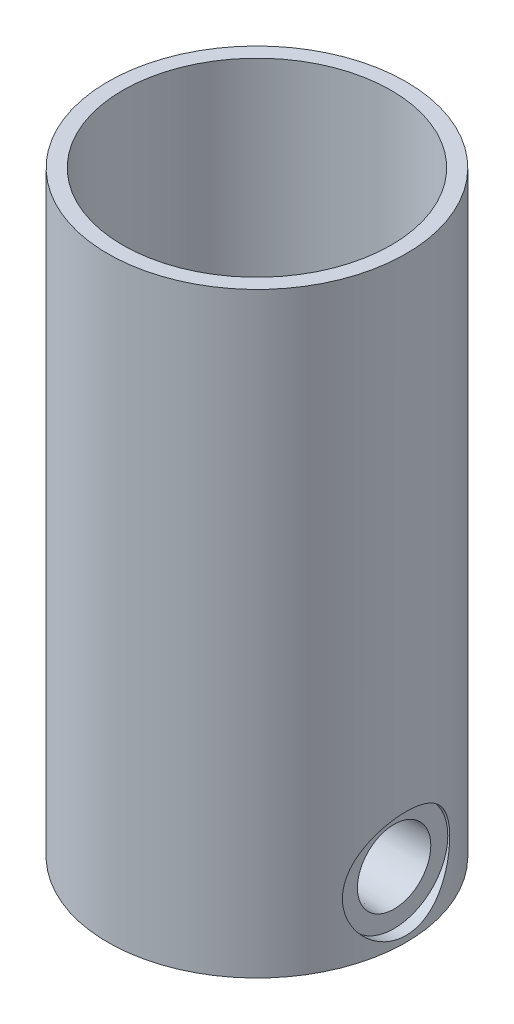
ISO-10303-21;
HEADER;
FILE_DESCRIPTION(('STEP AP214'),'2;1');
FILE_NAME('part.step','',(''),(''),'','','');
FILE_SCHEMA(('AUTOMOTIVE_DESIGN { 1 0 10303 214 1 1 1 1 }'));
ENDSEC;
DATA;
#1=APPLICATION_CONTEXT('core data for automotive mechanical design processes');
#2=APPLICATION_PROTOCOL_DEFINITION('international standard','automotive_design',2000,#1);
#3=PRODUCT_CONTEXT('',#1,'mechanical');
#4=PRODUCT('Part','Part','',(#3));
#5=PRODUCT_RELATED_PRODUCT_CATEGORY('part','',(#4));
#6=PRODUCT_DEFINITION_FORMATION('','',#4);
#7=PRODUCT_DEFINITION_CONTEXT('part definition',#1,'design');
#8=PRODUCT_DEFINITION('design','',#6,#7);
#9=PRODUCT_DEFINITION_SHAPE('','',#8);
#10=(LENGTH_UNIT() NAMED_UNIT(*) SI_UNIT(.MILLI.,.METRE.));
#11=(NAMED_UNIT(*) PLANE_ANGLE_UNIT() SI_UNIT($,.RADIAN.));
#12=(NAMED_UNIT(*) SI_UNIT($,.STERADIAN.) SOLID_ANGLE_UNIT());
#13=UNCERTAINTY_MEASURE_WITH_UNIT(LENGTH_MEASURE(1.E-05),#10,'distance_accuracy_value','');
#14=(GEOMETRIC_REPRESENTATION_CONTEXT(3) GLOBAL_UNCERTAINTY_ASSIGNED_CONTEXT((#13)) GLOBAL_UNIT_ASSIGNED_CONTEXT((#10,
#11,#12)) REPRESENTATION_CONTEXT('',''));
#15=CARTESIAN_POINT('',(0.,0.,0.));
#16=DIRECTION('',(0.,0.,1.));
#17=DIRECTION('',(1.,0.,0.));
#18=AXIS2_PLACEMENT_3D('',#15,#16,#17);
#19=CARTESIAN_POINT('',(5.30999999995174,10.,0.));
#20=DIRECTION('',(1.,0.,0.));
#21=DIRECTION('',(0.,0.,-1.));
#22=AXIS2_PLACEMENT_3D('',#19,#20,#21);
#23=CONICAL_SURFACE('',#22,5.34999999996444,1.02974425867466);
#24=CARTESIAN_POINT('',(2.09539568822948,10.,0.));
#25=VERTEX_POINT('',#24);
#26=VERTEX_LOOP('',#25);
#27=FACE_BOUND('',#26,.T.);
#28=CARTESIAN_POINT('',(5.31,10.,0.));
#29=DIRECTION('',(1.,0.,0.));
#30=DIRECTION('',(0.,0.,-1.));
#31=AXIS2_PLACEMENT_3D('',#28,#29,#30);
#32=CIRCLE('',#31,5.35);
#33=CARTESIAN_POINT('',(5.31,10.,-5.35));
#34=VERTEX_POINT('',#33);
#35=EDGE_CURVE('E32',#34,#34,#32,.T.);
#36=ORIENTED_EDGE('',*,*,#35,.T.);
#37=EDGE_LOOP('',(#36));
#38=FACE_BOUND('',#37,.T.);
#39=ADVANCED_FACE('F16',(#27,#38),#23,.F.);
#40=CARTESIAN_POINT('',(23.,10.,0.));
#41=DIRECTION('',(1.,0.,0.));
#42=DIRECTION('',(0.,0.,-1.));
#43=AXIS2_PLACEMENT_3D('',#40,#41,#42);
#44=CYLINDRICAL_SURFACE('',#43,5.35);
#45=ORIENTED_EDGE('',*,*,#35,.F.);
#46=EDGE_LOOP('',(#45));
#47=FACE_BOUND('',#46,.T.);
#48=CARTESIAN_POINT('',(12.,10.,0.));
#49=DIRECTION('',(1.,0.,0.));
#50=DIRECTION('',(0.,0.,-1.));
#51=AXIS2_PLACEMENT_3D('',#48,#49,#50);
#52=CIRCLE('',#51,5.35);
#53=CARTESIAN_POINT('',(12.,10.,-5.35));
#54=VERTEX_POINT('',#53);
#55=EDGE_CURVE('E19',#54,#54,#52,.T.);
#56=ORIENTED_EDGE('',*,*,#55,.T.);
#57=EDGE_LOOP('',(#56));
#58=FACE_BOUND('',#57,.T.);
#59=ADVANCED_FACE('F29',(#47,#58),#44,.F.);
#60=CARTESIAN_POINT('',(12.,15.35,0.));
#61=DIRECTION('',(-1.,0.,0.));
#62=DIRECTION('',(0.,0.,1.));
#63=AXIS2_PLACEMENT_3D('',#60,#61,#62);
#64=PLANE('',#63);
#65=CARTESIAN_POINT('',(12.0000000000005,10.,0.));
#66=DIRECTION('',(1.,0.,0.));
#67=DIRECTION('',(0.,0.,-1.));
#68=AXIS2_PLACEMENT_3D('',#65,#66,#67);
#69=CIRCLE('',#68,5.81061716828301);
#70=CARTESIAN_POINT('',(12.0000000000005,10.,-5.81061716828301));
#71=VERTEX_POINT('',#70);
#72=EDGE_CURVE('E36',#71,#71,#69,.T.);
#73=ORIENTED_EDGE('',*,*,#72,.T.);
#74=EDGE_LOOP('',(#73));
#75=FACE_BOUND('',#74,.T.);
#76=ORIENTED_EDGE('',*,*,#55,.F.);
#77=EDGE_LOOP('',(#76));
#78=FACE_BOUND('',#77,.T.);
#79=ADVANCED_FACE('F90',(#75,#78),#64,.F.);
#80=CARTESIAN_POINT('',(22.9999999999108,10.,0.));
#81=DIRECTION('',(1.,0.,0.));
#82=DIRECTION('',(0.,0.,-1.));
#83=AXIS2_PLACEMENT_3D('',#80,#81,#82);
#84=CONICAL_SURFACE('',#83,6.15399999999688,0.0312064870254975);
#85=CARTESIAN_POINT('',(23.0000000000245,10.,0.));
#86=DIRECTION('',(1.,0.,0.));
#87=DIRECTION('',(0.,0.,-1.));
#88=AXIS2_PLACEMENT_3D('',#85,#86,#87);
#89=CIRCLE('',#88,6.15400000000043);
#90=CARTESIAN_POINT('',(23.0000000000245,10.,-6.15400000000043));
#91=VERTEX_POINT('',#90);
#92=EDGE_CURVE('E83',#91,#91,#89,.F.);
#93=ORIENTED_EDGE('',*,*,#92,.F.);
#94=EDGE_LOOP('',(#93));
#95=FACE_BOUND('',#94,.T.);
#96=ORIENTED_EDGE('',*,*,#72,.F.);
#97=EDGE_LOOP('',(#96));
#98=FACE_BOUND('',#97,.T.);
#99=ADVANCED_FACE('F93',(#95,#98),#84,.F.);
#100=CARTESIAN_POINT('',(0.,20.,0.));
#101=DIRECTION('',(0.,1.,0.));
#102=DIRECTION('',(0.,0.,1.));
#103=AXIS2_PLACEMENT_3D('',#100,#101,#102);
#104=PLANE('',#103);
#105=CARTESIAN_POINT('',(0.,20.,0.));
#106=DIRECTION('',(0.,1.,0.));
#107=DIRECTION('',(0.,0.,1.));
#108=AXIS2_PLACEMENT_3D('',#105,#106,#107);
#109=CIRCLE('',#108,22.5);
#110=CARTESIAN_POINT('',(0.,20.,22.5));
#111=VERTEX_POINT('',#110);
#112=EDGE_CURVE('E79',#111,#111,#109,.T.);
#113=ORIENTED_EDGE('',*,*,#112,.T.);
#114=EDGE_LOOP('',(#113));
#115=FACE_BOUND('',#114,.T.);
#116=ADVANCED_FACE('F95',(#115),#104,.T.);
#117=CARTESIAN_POINT('',(23.,10.,0.));
#118=DIRECTION('',(1.,0.,0.));
#119=DIRECTION('',(0.,0.,-1.));
#120=AXIS2_PLACEMENT_3D('',#117,#118,#119);
#121=PLANE('',#120);
#122=CARTESIAN_POINT('',(23.,10.,0.));
#123=DIRECTION('',(1.,0.,0.));
#124=DIRECTION('',(0.,0.,-1.));
#125=AXIS2_PLACEMENT_3D('',#122,#123,#124);
#126=CIRCLE('',#125,9.);
#127=CARTESIAN_POINT('',(23.,10.,-9.));
#128=VERTEX_POINT('',#127);
#129=EDGE_CURVE('E77',#128,#128,#126,.T.);
#130=ORIENTED_EDGE('',*,*,#129,.T.);
#131=EDGE_LOOP('',(#130));
#132=FACE_BOUND('',#131,.T.);
#133=ORIENTED_EDGE('',*,*,#92,.T.);
#134=EDGE_LOOP('',(#133));
#135=FACE_BOUND('',#134,.T.);
#136=ADVANCED_FACE('F103',(#132,#135),#121,.T.);
#137=CARTESIAN_POINT('',(0.,20.,0.));
#138=DIRECTION('',(0.,1.,0.));
#139=DIRECTION('',(0.,0.,1.));
#140=AXIS2_PLACEMENT_3D('',#137,#138,#139);
#141=CYLINDRICAL_SURFACE('',#140,22.5);
#142=CARTESIAN_POINT('',(0.,100.,0.));
#143=DIRECTION('',(0.,1.,0.));
#144=DIRECTION('',(0.,0.,1.));
#145=AXIS2_PLACEMENT_3D('',#142,#143,#144);
#146=CIRCLE('',#145,22.5);
#147=CARTESIAN_POINT('',(0.,100.,22.5));
#148=VERTEX_POINT('',#147);
#149=EDGE_CURVE('E48',#148,#148,#146,.F.);
#150=ORIENTED_EDGE('',*,*,#149,.F.);
#151=EDGE_LOOP('',(#150));
#152=FACE_BOUND('',#151,.T.);
#153=ORIENTED_EDGE('',*,*,#112,.F.);
#154=EDGE_LOOP('',(#153));
#155=FACE_BOUND('',#154,.T.);
#156=ADVANCED_FACE('F70',(#152,#155),#141,.F.);
#157=CARTESIAN_POINT('',(23.,10.,0.));
#158=DIRECTION('',(1.,0.,0.));
#159=DIRECTION('',(0.,0.,-1.));
#160=AXIS2_PLACEMENT_3D('',#157,#158,#159);
#161=CYLINDRICAL_SURFACE('',#160,9.);
#162=ORIENTED_EDGE('',*,*,#129,.F.);
#163=EDGE_LOOP('',(#162));
#164=FACE_BOUND('',#163,.T.);
#165=CARTESIAN_POINT('',(23.3238075793812,10.,9.));
#166=CARTESIAN_POINT('',(23.3238073243132,10.2435480961337,9.00000030787731));
#167=CARTESIAN_POINT('',(23.3276327611524,10.4870920076392,8.99010557007337));
#168=CARTESIAN_POINT('',(23.3428097242563,10.9724290694668,8.95062457763446));
#169=CARTESIAN_POINT('',(23.3541639587674,11.214221558118,8.92103123703639));
#170=CARTESIAN_POINT('',(23.384048383551,11.6944711134606,8.84240049878084));
#171=CARTESIAN_POINT('',(23.4025872864994,11.9329237648284,8.79333949141597));
#172=CARTESIAN_POINT('',(23.4462553154958,12.4045931693559,8.6762325371848));
#173=CARTESIAN_POINT('',(23.4713870508155,12.6378078096847,8.60817907291485));
#174=CARTESIAN_POINT('',(23.5273723206745,13.0965956549283,8.45396081778693));
#175=CARTESIAN_POINT('',(23.5582066395291,13.3221915990969,8.36785672475123));
#176=CARTESIAN_POINT('',(23.6247439265045,13.7651791528606,8.17811486576643));
#177=CARTESIAN_POINT('',(23.6604487349791,13.9825676213604,8.07447046849236));
#178=CARTESIAN_POINT('',(23.7733436595022,14.6202182677816,7.73847997898592));
#179=CARTESIAN_POINT('',(23.8563779986869,15.0264597965972,7.48090928227957));
#180=CARTESIAN_POINT('',(24.0328982845355,15.807886743529,6.89328062382664));
#181=CARTESIAN_POINT('',(24.126675687287,16.1810704981816,6.56064766190437));
#182=CARTESIAN_POINT('',(24.2653504590756,16.6958631602608,6.01894530819016));
#183=CARTESIAN_POINT('',(24.3112719799821,16.8600533669467,5.83111968311396));
#184=CARTESIAN_POINT('',(24.4012650471891,17.1724540222947,5.44224434122988));
#185=CARTESIAN_POINT('',(24.445337279347,17.3206704278283,5.24119959937723));
#186=CARTESIAN_POINT('',(24.5318183066782,17.6045360240128,4.82052368047023));
#187=CARTESIAN_POINT('',(24.5741310241652,17.7396425325252,4.60050658572886));
#188=CARTESIAN_POINT('',(24.6543530961232,17.9906991287134,4.14914204951195));
#189=CARTESIAN_POINT('',(24.6922642118277,18.1066568863666,3.91779919291209));
#190=CARTESIAN_POINT('',(24.7626135989154,18.3184744440412,3.44528852807126));
#191=CARTESIAN_POINT('',(24.7950520574702,18.414334931441,3.20412105619452));
#192=CARTESIAN_POINT('',(24.8535057078059,18.5850558862034,2.71370893714171));
#193=CARTESIAN_POINT('',(24.8795212247739,18.6599174167488,2.46446469960744));
#194=CARTESIAN_POINT('',(24.9234531575662,18.7853187023571,1.96992873746335));
#195=CARTESIAN_POINT('',(24.9416522287863,18.8367125132072,1.72487854395111));
#196=CARTESIAN_POINT('',(24.9709033041867,18.9189401031247,1.23092932674485));
#197=CARTESIAN_POINT('',(24.981955482426,18.9497743829099,0.982030396936097));
#198=CARTESIAN_POINT('',(24.9965951570933,18.9905579444825,0.482372548708611));
#199=CARTESIAN_POINT('',(25.0001845729269,19.0005125964689,0.231614125202867));
#200=CARTESIAN_POINT('',(24.9998008080279,18.9994467950294,-0.269848987167858));
#201=CARTESIAN_POINT('',(24.9958278355521,18.9884269192102,-0.520553677322428));
#202=CARTESIAN_POINT('',(24.9807890548194,18.9465176705321,-1.00846369762336));
#203=CARTESIAN_POINT('',(24.9700572306013,18.9165636715909,-1.2457603941473));
#204=CARTESIAN_POINT('',(24.9420902940837,18.8379419685463,-1.71692917454452));
#205=CARTESIAN_POINT('',(24.924852889067,18.7892676668596,-1.95080002084846));
#206=CARTESIAN_POINT('',(24.8843240187623,18.6736674879414,-2.41336035498828));
#207=CARTESIAN_POINT('',(24.8610345632886,18.6067476694675,-2.64205153557177));
#208=CARTESIAN_POINT('',(24.8089757310198,18.4551960250315,-3.09293559397755));
#209=CARTESIAN_POINT('',(24.7802042809373,18.3705574966634,-3.31512597640812));
#210=CARTESIAN_POINT('',(24.7174684502777,18.1829801069218,-3.7545560167518));
#211=CARTESIAN_POINT('',(24.6834381182547,18.0798056605647,-3.97168562384794));
#212=CARTESIAN_POINT('',(24.6113147086744,17.8567139176044,-4.39654858319698));
#213=CARTESIAN_POINT('',(24.5732202451411,17.7367909049618,-4.60427869535941));
#214=CARTESIAN_POINT('',(24.4939075926443,17.4810615783391,-5.00909562366494));
#215=CARTESIAN_POINT('',(24.4526893078855,17.3452547771972,-5.20618211309284));
#216=CARTESIAN_POINT('',(24.3681246415849,17.0586292367222,-5.58863726075696));
#217=CARTESIAN_POINT('',(24.3247781694674,16.9078098581719,-5.77400541949094));
#218=CARTESIAN_POINT('',(24.2346122025625,16.5834636498304,-6.14177014388652));
#219=CARTESIAN_POINT('',(24.1877320364221,16.4091479483897,-6.32345679541469));
#220=CARTESIAN_POINT('',(24.0940436010193,16.0459658089521,-6.67154767921443));
#221=CARTESIAN_POINT('',(24.0472353141742,15.8571038302793,-6.83795656103631));
#222=CARTESIAN_POINT('',(23.9549164492251,15.4657303524532,-7.15466385531899));
#223=CARTESIAN_POINT('',(23.9094070718585,15.2632067709807,-7.30494769430942));
#224=CARTESIAN_POINT('',(23.8210334114199,14.8459449608586,-7.58817324365145));
#225=CARTESIAN_POINT('',(23.7781681014745,14.6312115371974,-7.72112170915382));
#226=CARTESIAN_POINT('',(23.6954920847915,14.186295481361,-7.97128396581193));
#227=CARTESIAN_POINT('',(23.6557607070244,13.9558882038408,-8.0881250720159));
#228=CARTESIAN_POINT('',(23.5816254549226,13.4852576369153,-8.30179099219553));
#229=CARTESIAN_POINT('',(23.5472193314781,13.2450385459866,-8.39862426225754));
#230=CARTESIAN_POINT('',(23.4849178328481,12.7567883798555,-8.57129246546306));
#231=CARTESIAN_POINT('',(23.4570118703062,12.5087707654491,-8.64716158276735));
#232=CARTESIAN_POINT('',(23.4086254641956,12.0065324114958,-8.77730504442026));
#233=CARTESIAN_POINT('',(23.3881416337987,11.752314557875,-8.83158923939081));
#234=CARTESIAN_POINT('',(23.355943822152,11.2492879535746,-8.91638185624351));
#235=CARTESIAN_POINT('',(23.3439284450446,11.0006363800106,-8.94770916066033));
#236=CARTESIAN_POINT('',(23.3278604446585,10.501321730238,-8.98951810096024));
#237=CARTESIAN_POINT('',(23.3238078418961,10.2506586488484,-8.999999683134));
#238=CARTESIAN_POINT('',(23.3238073243132,9.75645190386629,-9.00000030787731));
#239=CARTESIAN_POINT('',(23.3276327611524,9.51290799236075,-8.99010557007337));
#240=CARTESIAN_POINT('',(23.3428097242563,9.02757093053317,-8.95062457763446));
#241=CARTESIAN_POINT('',(23.3541639587674,8.78577844188204,-8.92103123703639));
#242=CARTESIAN_POINT('',(23.384048383551,8.30552888653945,-8.84240049878084));
#243=CARTESIAN_POINT('',(23.4025872864994,8.06707623517158,-8.79333949141597));
#244=CARTESIAN_POINT('',(23.4462553154958,7.59540683064414,-8.67623253718479));
#245=CARTESIAN_POINT('',(23.4713870508155,7.36219219031527,-8.60817907291485));
#246=CARTESIAN_POINT('',(23.5273723206745,6.90340434507166,-8.45396081778693));
#247=CARTESIAN_POINT('',(23.5582066395291,6.6778084009031,-8.36785672475123));
#248=CARTESIAN_POINT('',(23.6247439265045,6.23482084713936,-8.17811486576643));
#249=CARTESIAN_POINT('',(23.6604487349791,6.01743237863956,-8.07447046849237));
#250=CARTESIAN_POINT('',(23.7733436595022,5.37978173221838,-7.73847997898592));
#251=CARTESIAN_POINT('',(23.8563779986869,4.97354020340285,-7.48090928227956));
#252=CARTESIAN_POINT('',(24.0328982845355,4.19211325647103,-6.89328062382664));
#253=CARTESIAN_POINT('',(24.126675687287,3.8189295018184,-6.56064766190437));
#254=CARTESIAN_POINT('',(24.2653504590756,3.30413683973925,-6.01894530819017));
#255=CARTESIAN_POINT('',(24.3112719799821,3.13994663305328,-5.83111968311397));
#256=CARTESIAN_POINT('',(24.401265047189,2.82754597770531,-5.44224434122988));
#257=CARTESIAN_POINT('',(24.445337279347,2.67932957217174,-5.24119959937724));
#258=CARTESIAN_POINT('',(24.5318183066782,2.39546397598718,-4.82052368047024));
#259=CARTESIAN_POINT('',(24.5741310241652,2.26035746747484,-4.60050658572887));
#260=CARTESIAN_POINT('',(24.6543530961232,2.00930087128666,-4.14914204951196));
#261=CARTESIAN_POINT('',(24.6922642118277,1.8933431136334,-3.9177991929121));
#262=CARTESIAN_POINT('',(24.7626135989154,1.68152555595881,-3.44528852807127));
#263=CARTESIAN_POINT('',(24.7950520574702,1.58566506855904,-3.20412105619452));
#264=CARTESIAN_POINT('',(24.8535057078059,1.41494411379662,-2.71370893714171));
#265=CARTESIAN_POINT('',(24.8795212247739,1.34008258325123,-2.46446469960744));
#266=CARTESIAN_POINT('',(24.9234531575662,1.21468129764288,-1.96992873746336));
#267=CARTESIAN_POINT('',(24.9416522287863,1.16328748679276,-1.72487854395111));
#268=CARTESIAN_POINT('',(24.9709033041867,1.08105989687533,-1.23092932674485));
#269=CARTESIAN_POINT('',(24.981955482426,1.05022561709011,-0.982030396936098));
#270=CARTESIAN_POINT('',(24.9965951570933,1.0094420555175,-0.482372548708612));
#271=CARTESIAN_POINT('',(25.0001845729269,0.999487403531131,-0.23161412520287));
#272=CARTESIAN_POINT('',(24.9998008080279,1.00055320497062,0.269848987167854));
#273=CARTESIAN_POINT('',(24.9958278355521,1.01157308078975,0.520553677322424));
#274=CARTESIAN_POINT('',(24.9807890548194,1.05348232946783,1.00846369762335));
#275=CARTESIAN_POINT('',(24.9700572306013,1.08343632840906,1.2457603941473));
#276=CARTESIAN_POINT('',(24.9420902940837,1.16205803145375,1.71692917454451));
#277=CARTESIAN_POINT('',(24.924852889067,1.21073233314036,1.95080002084845));
#278=CARTESIAN_POINT('',(24.8843240187623,1.32633251205861,2.41336035498828));
#279=CARTESIAN_POINT('',(24.8610345632886,1.39325233053248,2.64205153557177));
#280=CARTESIAN_POINT('',(24.8089757310198,1.5448039749685,3.09293559397755));
#281=CARTESIAN_POINT('',(24.7802042809373,1.62944250333661,3.31512597640812));
#282=CARTESIAN_POINT('',(24.7174684502777,1.81701989307827,3.7545560167518));
#283=CARTESIAN_POINT('',(24.6834381182547,1.92019433943532,3.97168562384794));
#284=CARTESIAN_POINT('',(24.6113147086743,2.14328608239556,4.39654858319699));
#285=CARTESIAN_POINT('',(24.5732202451411,2.26320909503822,4.60427869535941));
#286=CARTESIAN_POINT('',(24.4939075926443,2.51893842166086,5.00909562366494));
#287=CARTESIAN_POINT('',(24.4526893078855,2.65474522280282,5.20618211309285));
#288=CARTESIAN_POINT('',(24.3681246415849,2.94137076327782,5.58863726075696));
#289=CARTESIAN_POINT('',(24.3247781694674,3.09219014182815,5.77400541949094));
#290=CARTESIAN_POINT('',(24.2346122025625,3.41653635016964,6.14177014388652));
#291=CARTESIAN_POINT('',(24.1877320364221,3.59085205161035,6.3234567954147));
#292=CARTESIAN_POINT('',(24.0940436010193,3.95403419104791,6.67154767921443));
#293=CARTESIAN_POINT('',(24.0472353141742,4.1428961697207,6.83795656103631));
#294=CARTESIAN_POINT('',(23.9549164492251,4.53426964754683,7.15466385531899));
#295=CARTESIAN_POINT('',(23.9094070718585,4.73679322901929,7.30494769430942));
#296=CARTESIAN_POINT('',(23.8210334114199,5.15405503914138,7.58817324365145));
#297=CARTESIAN_POINT('',(23.7781681014745,5.36878846280266,7.72112170915382));
#298=CARTESIAN_POINT('',(23.6954920847915,5.81370451863899,7.97128396581193));
#299=CARTESIAN_POINT('',(23.6557607070244,6.0441117961592,8.0881250720159));
#300=CARTESIAN_POINT('',(23.5816254549226,6.51474236308472,8.30179099219553));
#301=CARTESIAN_POINT('',(23.5472193314781,6.75496145401342,8.39862426225755));
#302=CARTESIAN_POINT('',(23.4849178328481,7.24321162014453,8.57129246546307));
#303=CARTESIAN_POINT('',(23.4570118703062,7.49122923455091,8.64716158276735));
#304=CARTESIAN_POINT('',(23.4086254641956,7.99346758850425,8.77730504442026));
#305=CARTESIAN_POINT('',(23.3881416337987,8.247685442125,8.83158923939081));
#306=CARTESIAN_POINT('',(23.355943822152,8.7507120464254,8.91638185624351));
#307=CARTESIAN_POINT('',(23.3439284450446,8.99936361998942,8.94770916066033));
#308=CARTESIAN_POINT('',(23.3278604446585,9.49867826976204,8.98951810096024));
#309=CARTESIAN_POINT('',(23.3238078418961,9.74934135115165,8.999999683134));
#310=CARTESIAN_POINT('',(23.3238075793812,10.,9.));
#311=B_SPLINE_CURVE_WITH_KNOTS('',3,(#165,#166,#167,#168,#169,#170,#171,#172,#173,#174,#175,
#176,#177,#178,#179,#180,#181,#182,#183,#184,#185,#186,#187,#188,#189,#190,#191,#192,#193,#194,
#195,#196,#197,#198,#199,#200,#201,#202,#203,#204,#205,#206,#207,#208,#209,#210,#211,#212,#213,
#214,#215,#216,#217,#218,#219,#220,#221,#222,#223,#224,#225,#226,#227,#228,#229,#230,#231,#232,
#233,#234,#235,#236,#237,#238,#239,#240,#241,#242,#243,#244,#245,#246,#247,#248,#249,#250,#251,
#252,#253,#254,#255,#256,#257,#258,#259,#260,#261,#262,#263,#264,#265,#266,#267,#268,#269,#270,
#271,#272,#273,#274,#275,#276,#277,#278,#279,#280,#281,#282,#283,#284,#285,#286,#287,#288,#289,
#290,#291,#292,#293,#294,#295,#296,#297,#298,#299,#300,#301,#302,#303,#304,#305,#306,#307,#308,
#309,#310),.UNSPECIFIED.,.T.,.F.,(4,2,2,2,2,2,2,2,2,2,2,2,2,2,2,2,2,2,2,2,2,2,2,2,2,2,2,2,2,2,2,
2,2,2,2,2,2,2,2,2,2,2,2,2,2,2,2,2,2,2,2,2,2,2,2,2,2,2,2,2,2,2,2,2,2,2,2,2,2,2,2,2,4),(0.,
0.730407406057239,1.46107769567794,2.19263683840165,2.92448595119583,3.65391249633353,
4.38361542861543,5.84146341695007,7.36010847774713,8.12039581185229,8.88039863507572,
9.66433277345588,10.4479521435982,11.231544707564,12.0150975908675,12.7672671817654,
13.519418453251,14.2713762491836,15.0233133376369,15.7407312123374,16.4584021581468,
17.1758350778294,17.8935398707729,18.6211111894416,19.348931427066,20.0767739930773,
20.8046475630077,21.572107651109,22.3393333950799,23.1072468021528,23.8748600730476,
24.6580008132132,25.4408098876804,26.2223348777712,27.0035027960499,27.7552330074672,
28.5069651557268,29.237372561784,29.9680428514047,30.6996019941285,31.4314511069226,
32.1608776520603,32.8905805843422,34.3484285726769,35.8670736334739,36.6273609675791,
37.3873637908025,38.1712979291827,38.954917299325,39.7385098632909,40.5220627465943,
41.2742323374923,42.0263836089778,42.7783414049104,43.5302784933637,44.2476963680642,
44.9653673138736,45.6828002335562,46.4005050264997,47.1280763451684,47.8558965827928,
48.5837391488041,49.3116127187345,50.0790728068358,50.8462985508067,51.6142119578796,
52.3818252287745,53.16496596894,53.9477750434072,54.729300033498,55.5104679517767,
56.262198163194,57.0139303114536),.UNSPECIFIED.);
#312=CARTESIAN_POINT('',(23.3238075793812,10.,9.));
#313=VERTEX_POINT('',#312);
#314=EDGE_CURVE('E40',#313,#313,#311,.T.);
#315=ORIENTED_EDGE('',*,*,#314,.F.);
#316=EDGE_LOOP('',(#315));
#317=FACE_BOUND('',#316,.T.);
#318=ADVANCED_FACE('F50',(#164,#317),#161,.F.);
#319=CARTESIAN_POINT('',(0.,100.,0.));
#320=DIRECTION('',(0.,1.,0.));
#321=DIRECTION('',(0.,0.,1.));
#322=AXIS2_PLACEMENT_3D('',#319,#320,#321);
#323=PLANE('',#322);
#324=CARTESIAN_POINT('',(0.,100.,0.));
#325=DIRECTION('',(0.,-1.,0.));
#326=DIRECTION('',(0.,0.,-1.));
#327=AXIS2_PLACEMENT_3D('',#324,#325,#326);
#328=CIRCLE('',#327,25.);
#329=CARTESIAN_POINT('',(0.,100.,-25.));
#330=VERTEX_POINT('',#329);
#331=EDGE_CURVE('E23',#330,#330,#328,.T.);
#332=ORIENTED_EDGE('',*,*,#331,.F.);
#333=EDGE_LOOP('',(#332));
#334=FACE_BOUND('',#333,.T.);
#335=ORIENTED_EDGE('',*,*,#149,.T.);
#336=EDGE_LOOP('',(#335));
#337=FACE_BOUND('',#336,.T.);
#338=ADVANCED_FACE('F61',(#334,#337),#323,.T.);
#339=CARTESIAN_POINT('',(0.,0.,0.));
#340=DIRECTION('',(0.,1.,0.));
#341=DIRECTION('',(0.,0.,1.));
#342=AXIS2_PLACEMENT_3D('',#339,#340,#341);
#343=PLANE('',#342);
#344=CARTESIAN_POINT('',(0.,0.,0.));
#345=DIRECTION('',(0.,-1.,0.));
#346=DIRECTION('',(0.,0.,-1.));
#347=AXIS2_PLACEMENT_3D('',#344,#345,#346);
#348=CIRCLE('',#347,25.);
#349=CARTESIAN_POINT('',(0.,0.,-25.));
#350=VERTEX_POINT('',#349);
#351=EDGE_CURVE('E11',#350,#350,#348,.F.);
#352=ORIENTED_EDGE('',*,*,#351,.F.);
#353=EDGE_LOOP('',(#352));
#354=FACE_BOUND('',#353,.T.);
#355=ADVANCED_FACE('F58',(#354),#343,.F.);
#356=CARTESIAN_POINT('',(0.,100.,0.));
#357=DIRECTION('',(0.,-1.,0.));
#358=DIRECTION('',(0.,0.,-1.));
#359=AXIS2_PLACEMENT_3D('',#356,#357,#358);
#360=CYLINDRICAL_SURFACE('',#359,25.);
#361=ORIENTED_EDGE('',*,*,#331,.T.);
#362=EDGE_LOOP('',(#361));
#363=FACE_BOUND('',#362,.T.);
#364=ORIENTED_EDGE('',*,*,#351,.T.);
#365=EDGE_LOOP('',(#364));
#366=FACE_BOUND('',#365,.T.);
#367=ORIENTED_EDGE('',*,*,#314,.T.);
#368=EDGE_LOOP('',(#367));
#369=FACE_BOUND('',#368,.T.);
#370=ADVANCED_FACE('F54',(#363,#366,#369),#360,.T.);
#371=CLOSED_SHELL('',(#39,#59,#79,#99,#116,#136,#156,#318,#338,#355,#370));
#372=MANIFOLD_SOLID_BREP('B1',#371);
#373=ADVANCED_BREP_SHAPE_REPRESENTATION('',(#18,#372),#14);
#374=SHAPE_DEFINITION_REPRESENTATION(#9,#373);
ENDSEC;
END-ISO-10303-21;
